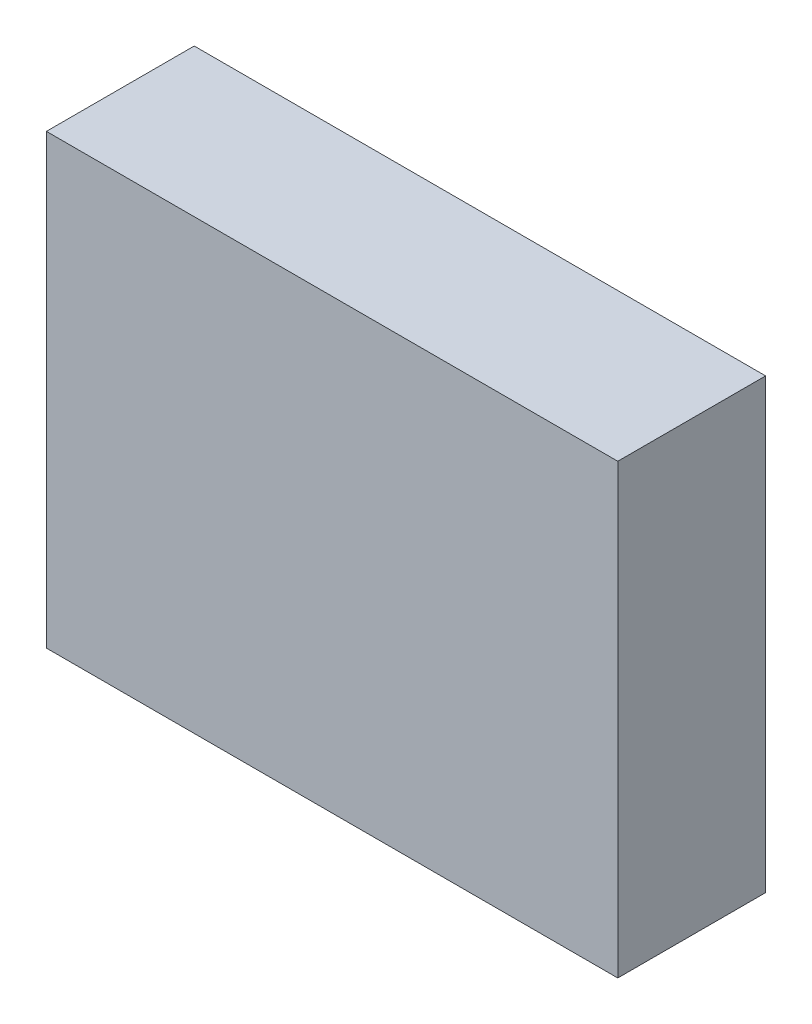
ISO-10303-21;
HEADER;
FILE_DESCRIPTION(('STEP AP214'),'2;1');
FILE_NAME('part.step','',(''),(''),'','','');
FILE_SCHEMA(('AUTOMOTIVE_DESIGN { 1 0 10303 214 1 1 1 1 }'));
ENDSEC;
DATA;
#1=APPLICATION_CONTEXT('core data for automotive mechanical design processes');
#2=APPLICATION_PROTOCOL_DEFINITION('international standard','automotive_design',2000,#1);
#3=PRODUCT_CONTEXT('',#1,'mechanical');
#4=PRODUCT('Part','Part','',(#3));
#5=PRODUCT_RELATED_PRODUCT_CATEGORY('part','',(#4));
#6=PRODUCT_DEFINITION_FORMATION('','',#4);
#7=PRODUCT_DEFINITION_CONTEXT('part definition',#1,'design');
#8=PRODUCT_DEFINITION('design','',#6,#7);
#9=PRODUCT_DEFINITION_SHAPE('','',#8);
#10=(LENGTH_UNIT() NAMED_UNIT(*) SI_UNIT(.MILLI.,.METRE.));
#11=(NAMED_UNIT(*) PLANE_ANGLE_UNIT() SI_UNIT($,.RADIAN.));
#12=(NAMED_UNIT(*) SI_UNIT($,.STERADIAN.) SOLID_ANGLE_UNIT());
#13=UNCERTAINTY_MEASURE_WITH_UNIT(LENGTH_MEASURE(1.E-05),#10,'distance_accuracy_value','');
#14=(GEOMETRIC_REPRESENTATION_CONTEXT(3) GLOBAL_UNCERTAINTY_ASSIGNED_CONTEXT((#13)) GLOBAL_UNIT_ASSIGNED_CONTEXT((#10,
#11,#12)) REPRESENTATION_CONTEXT('',''));
#15=CARTESIAN_POINT('',(0.,0.,0.));
#16=DIRECTION('',(0.,0.,1.));
#17=DIRECTION('',(1.,0.,0.));
#18=AXIS2_PLACEMENT_3D('',#15,#16,#17);
#19=CARTESIAN_POINT('',(62.,-56.,218.5));
#20=DIRECTION('',(0.,0.,1.));
#21=DIRECTION('',(1.,0.,0.));
#22=AXIS2_PLACEMENT_3D('',#19,#20,#21);
#23=PLANE('',#22);
#24=DIRECTION('',(0.,1.,0.));
#25=VECTOR('',#24,1.);
#26=CARTESIAN_POINT('',(62.,-56.,218.5));
#27=LINE('',#26,#25);
#28=CARTESIAN_POINT('',(62.,-56.,218.5));
#29=VERTEX_POINT('',#28);
#30=CARTESIAN_POINT('',(62.,56.,218.5));
#31=VERTEX_POINT('',#30);
#32=EDGE_CURVE('E91',#29,#31,#27,.T.);
#33=ORIENTED_EDGE('',*,*,#32,.F.);
#34=DIRECTION('',(1.,0.,0.));
#35=VECTOR('',#34,1.);
#36=CARTESIAN_POINT('',(62.,-56.,218.5));
#37=LINE('',#36,#35);
#38=CARTESIAN_POINT('',(205.,-56.,218.5));
#39=VERTEX_POINT('',#38);
#40=EDGE_CURVE('E62',#29,#39,#37,.T.);
#41=ORIENTED_EDGE('',*,*,#40,.T.);
#42=DIRECTION('',(0.,1.,0.));
#43=VECTOR('',#42,1.);
#44=CARTESIAN_POINT('',(205.,-56.,218.5));
#45=LINE('',#44,#43);
#46=CARTESIAN_POINT('',(205.,56.,218.5));
#47=VERTEX_POINT('',#46);
#48=EDGE_CURVE('E101',#39,#47,#45,.T.);
#49=ORIENTED_EDGE('',*,*,#48,.T.);
#50=DIRECTION('',(1.,0.,0.));
#51=VECTOR('',#50,1.);
#52=CARTESIAN_POINT('',(62.,56.,218.5));
#53=LINE('',#52,#51);
#54=EDGE_CURVE('E9',#31,#47,#53,.T.);
#55=ORIENTED_EDGE('',*,*,#54,.F.);
#56=EDGE_LOOP('',(#33,#41,#49,#55));
#57=FACE_BOUND('',#56,.T.);
#58=ADVANCED_FACE('F14',(#57),#23,.T.);
#59=CARTESIAN_POINT('',(62.,-56.,181.5));
#60=DIRECTION('',(0.,0.,1.));
#61=DIRECTION('',(1.,0.,0.));
#62=AXIS2_PLACEMENT_3D('',#59,#60,#61);
#63=PLANE('',#62);
#64=DIRECTION('',(1.,0.,0.));
#65=VECTOR('',#64,1.);
#66=CARTESIAN_POINT('',(62.,56.,181.5));
#67=LINE('',#66,#65);
#68=CARTESIAN_POINT('',(62.,56.,181.5));
#69=VERTEX_POINT('',#68);
#70=CARTESIAN_POINT('',(205.,56.,181.5));
#71=VERTEX_POINT('',#70);
#72=EDGE_CURVE('E25',#69,#71,#67,.T.);
#73=ORIENTED_EDGE('',*,*,#72,.T.);
#74=DIRECTION('',(0.,1.,0.));
#75=VECTOR('',#74,1.);
#76=CARTESIAN_POINT('',(205.,-56.,181.5));
#77=LINE('',#76,#75);
#78=CARTESIAN_POINT('',(205.,-56.,181.5));
#79=VERTEX_POINT('',#78);
#80=EDGE_CURVE('E18',#79,#71,#77,.T.);
#81=ORIENTED_EDGE('',*,*,#80,.F.);
#82=DIRECTION('',(1.,0.,0.));
#83=VECTOR('',#82,1.);
#84=CARTESIAN_POINT('',(62.,-56.,181.5));
#85=LINE('',#84,#83);
#86=CARTESIAN_POINT('',(62.,-56.,181.5));
#87=VERTEX_POINT('',#86);
#88=EDGE_CURVE('E83',#87,#79,#85,.T.);
#89=ORIENTED_EDGE('',*,*,#88,.F.);
#90=DIRECTION('',(0.,1.,0.));
#91=VECTOR('',#90,1.);
#92=CARTESIAN_POINT('',(62.,-56.,181.5));
#93=LINE('',#92,#91);
#94=EDGE_CURVE('E85',#87,#69,#93,.T.);
#95=ORIENTED_EDGE('',*,*,#94,.T.);
#96=EDGE_LOOP('',(#73,#81,#89,#95));
#97=FACE_BOUND('',#96,.T.);
#98=ADVANCED_FACE('F16',(#97),#63,.F.);
#99=CARTESIAN_POINT('',(62.,56.,181.5));
#100=DIRECTION('',(0.,1.,0.));
#101=DIRECTION('',(1.,0.,0.));
#102=AXIS2_PLACEMENT_3D('',#99,#100,#101);
#103=PLANE('',#102);
#104=ORIENTED_EDGE('',*,*,#72,.F.);
#105=DIRECTION('',(0.,0.,1.));
#106=VECTOR('',#105,1.);
#107=CARTESIAN_POINT('',(62.,56.,181.5));
#108=LINE('',#107,#106);
#109=EDGE_CURVE('E75',#69,#31,#108,.T.);
#110=ORIENTED_EDGE('',*,*,#109,.T.);
#111=ORIENTED_EDGE('',*,*,#54,.T.);
#112=DIRECTION('',(0.,0.,1.));
#113=VECTOR('',#112,1.);
#114=CARTESIAN_POINT('',(205.,56.,181.5));
#115=LINE('',#114,#113);
#116=EDGE_CURVE('E78',#71,#47,#115,.T.);
#117=ORIENTED_EDGE('',*,*,#116,.F.);
#118=EDGE_LOOP('',(#104,#110,#111,#117));
#119=FACE_BOUND('',#118,.T.);
#120=ADVANCED_FACE('F73',(#119),#103,.T.);
#121=CARTESIAN_POINT('',(62.,-56.,181.5));
#122=DIRECTION('',(0.,1.,0.));
#123=DIRECTION('',(1.,0.,0.));
#124=AXIS2_PLACEMENT_3D('',#121,#122,#123);
#125=PLANE('',#124);
#126=DIRECTION('',(0.,0.,1.));
#127=VECTOR('',#126,1.);
#128=CARTESIAN_POINT('',(205.,-56.,181.5));
#129=LINE('',#128,#127);
#130=EDGE_CURVE('E106',#79,#39,#129,.T.);
#131=ORIENTED_EDGE('',*,*,#130,.T.);
#132=ORIENTED_EDGE('',*,*,#40,.F.);
#133=DIRECTION('',(0.,0.,1.));
#134=VECTOR('',#133,1.);
#135=CARTESIAN_POINT('',(62.,-56.,181.5));
#136=LINE('',#135,#134);
#137=EDGE_CURVE('E88',#87,#29,#136,.T.);
#138=ORIENTED_EDGE('',*,*,#137,.F.);
#139=ORIENTED_EDGE('',*,*,#88,.T.);
#140=EDGE_LOOP('',(#131,#132,#138,#139));
#141=FACE_BOUND('',#140,.T.);
#142=ADVANCED_FACE('F104',(#141),#125,.F.);
#143=CARTESIAN_POINT('',(205.,-56.,181.5));
#144=DIRECTION('',(1.,0.,0.));
#145=DIRECTION('',(0.,1.,0.));
#146=AXIS2_PLACEMENT_3D('',#143,#144,#145);
#147=PLANE('',#146);
#148=ORIENTED_EDGE('',*,*,#130,.F.);
#149=ORIENTED_EDGE('',*,*,#80,.T.);
#150=ORIENTED_EDGE('',*,*,#116,.T.);
#151=ORIENTED_EDGE('',*,*,#48,.F.);
#152=EDGE_LOOP('',(#148,#149,#150,#151));
#153=FACE_BOUND('',#152,.T.);
#154=ADVANCED_FACE('F110',(#153),#147,.T.);
#155=CARTESIAN_POINT('',(62.,-56.,181.5));
#156=DIRECTION('',(1.,0.,0.));
#157=DIRECTION('',(0.,1.,0.));
#158=AXIS2_PLACEMENT_3D('',#155,#156,#157);
#159=PLANE('',#158);
#160=ORIENTED_EDGE('',*,*,#32,.T.);
#161=ORIENTED_EDGE('',*,*,#109,.F.);
#162=ORIENTED_EDGE('',*,*,#94,.F.);
#163=ORIENTED_EDGE('',*,*,#137,.T.);
#164=EDGE_LOOP('',(#160,#161,#162,#163));
#165=FACE_BOUND('',#164,.T.);
#166=ADVANCED_FACE('F90',(#165),#159,.F.);
#167=CLOSED_SHELL('',(#58,#98,#120,#142,#154,#166));
#168=MANIFOLD_SOLID_BREP('B1',#167);
#169=ADVANCED_BREP_SHAPE_REPRESENTATION('',(#18,#168),#14);
#170=SHAPE_DEFINITION_REPRESENTATION(#9,#169);
ENDSEC;
END-ISO-10303-21;
